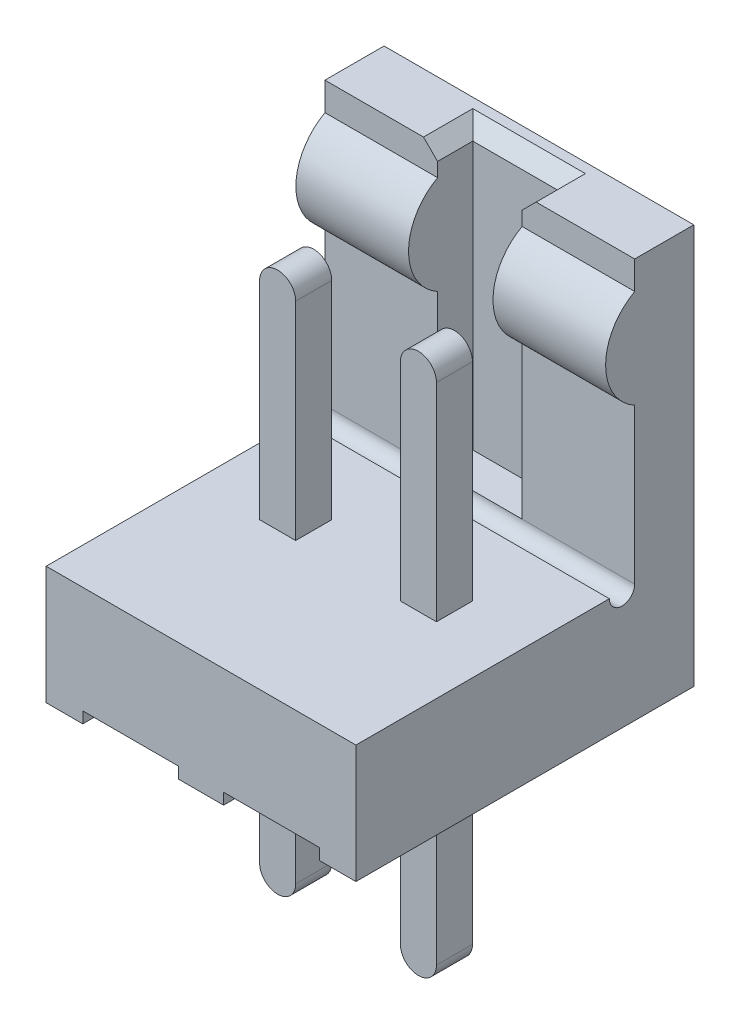
ISO-10303-21;
HEADER;
FILE_DESCRIPTION(('STEP AP214'),'2;1');
FILE_NAME('part.step','',(''),(''),'','','');
FILE_SCHEMA(('AUTOMOTIVE_DESIGN { 1 0 10303 214 1 1 1 1 }'));
ENDSEC;
DATA;
#1=APPLICATION_CONTEXT('core data for automotive mechanical design processes');
#2=APPLICATION_PROTOCOL_DEFINITION('international standard','automotive_design',2000,#1);
#3=PRODUCT_CONTEXT('',#1,'mechanical');
#4=PRODUCT('Part','Part','',(#3));
#5=PRODUCT_RELATED_PRODUCT_CATEGORY('part','',(#4));
#6=PRODUCT_DEFINITION_FORMATION('','',#4);
#7=PRODUCT_DEFINITION_CONTEXT('part definition',#1,'design');
#8=PRODUCT_DEFINITION('design','',#6,#7);
#9=PRODUCT_DEFINITION_SHAPE('','',#8);
#10=(LENGTH_UNIT() NAMED_UNIT(*) SI_UNIT(.MILLI.,.METRE.));
#11=(NAMED_UNIT(*) PLANE_ANGLE_UNIT() SI_UNIT($,.RADIAN.));
#12=(NAMED_UNIT(*) SI_UNIT($,.STERADIAN.) SOLID_ANGLE_UNIT());
#13=UNCERTAINTY_MEASURE_WITH_UNIT(LENGTH_MEASURE(1.E-05),#10,'distance_accuracy_value','');
#14=(GEOMETRIC_REPRESENTATION_CONTEXT(3) GLOBAL_UNCERTAINTY_ASSIGNED_CONTEXT((#13)) GLOBAL_UNIT_ASSIGNED_CONTEXT((#10,
#11,#12)) REPRESENTATION_CONTEXT('',''));
#15=CARTESIAN_POINT('',(0.,0.,0.));
#16=DIRECTION('',(0.,0.,1.));
#17=DIRECTION('',(1.,0.,0.));
#18=AXIS2_PLACEMENT_3D('',#15,#16,#17);
#19=CARTESIAN_POINT('',(1.25,-3.18,0.39));
#20=DIRECTION('',(0.,0.,-1.));
#21=DIRECTION('',(1.,0.,0.));
#22=AXIS2_PLACEMENT_3D('',#19,#20,#21);
#23=CYLINDRICAL_SURFACE('',#22,0.32);
#24=DIRECTION('',(0.,0.,-1.));
#25=VECTOR('',#24,1.);
#26=CARTESIAN_POINT('',(0.93,-3.18,0.39));
#27=LINE('',#26,#25);
#28=CARTESIAN_POINT('',(0.93,-3.18,0.39));
#29=VERTEX_POINT('',#28);
#30=CARTESIAN_POINT('',(0.93,-3.18,-0.25));
#31=VERTEX_POINT('',#30);
#32=EDGE_CURVE('E119',#29,#31,#27,.T.);
#33=ORIENTED_EDGE('',*,*,#32,.T.);
#34=CARTESIAN_POINT('',(1.25,-3.18,-0.25));
#35=DIRECTION('',(0.,0.,1.));
#36=DIRECTION('',(1.,0.,0.));
#37=AXIS2_PLACEMENT_3D('',#34,#35,#36);
#38=CIRCLE('',#37,0.32);
#39=CARTESIAN_POINT('',(1.57,-3.18,-0.25));
#40=VERTEX_POINT('',#39);
#41=EDGE_CURVE('E12',#31,#40,#38,.T.);
#42=ORIENTED_EDGE('',*,*,#41,.T.);
#43=DIRECTION('',(0.,0.,-1.));
#44=VECTOR('',#43,1.);
#45=CARTESIAN_POINT('',(1.57,-3.18,0.39));
#46=LINE('',#45,#44);
#47=CARTESIAN_POINT('',(1.57,-3.18,0.39));
#48=VERTEX_POINT('',#47);
#49=EDGE_CURVE('E121',#40,#48,#46,.F.);
#50=ORIENTED_EDGE('',*,*,#49,.T.);
#51=CARTESIAN_POINT('',(1.25,-3.18,0.39));
#52=DIRECTION('',(0.,0.,-1.));
#53=DIRECTION('',(-1.,0.,0.));
#54=AXIS2_PLACEMENT_3D('',#51,#52,#53);
#55=CIRCLE('',#54,0.32);
#56=EDGE_CURVE('E61',#48,#29,#55,.T.);
#57=ORIENTED_EDGE('',*,*,#56,.T.);
#58=EDGE_LOOP('',(#33,#42,#50,#57));
#59=FACE_BOUND('',#58,.T.);
#60=ADVANCED_FACE('F54',(#59),#23,.T.);
#61=CARTESIAN_POINT('',(1.25,5.78,-0.25));
#62=DIRECTION('',(0.,0.,-1.));
#63=DIRECTION('',(1.,0.,0.));
#64=AXIS2_PLACEMENT_3D('',#61,#62,#63);
#65=CYLINDRICAL_SURFACE('',#64,0.32);
#66=DIRECTION('',(0.,0.,1.));
#67=VECTOR('',#66,1.);
#68=CARTESIAN_POINT('',(0.93,5.78,-0.25));
#69=LINE('',#68,#67);
#70=CARTESIAN_POINT('',(0.93,5.78,-0.25));
#71=VERTEX_POINT('',#70);
#72=CARTESIAN_POINT('',(0.93,5.78,0.39));
#73=VERTEX_POINT('',#72);
#74=EDGE_CURVE('E106',#71,#73,#69,.T.);
#75=ORIENTED_EDGE('',*,*,#74,.T.);
#76=CARTESIAN_POINT('',(1.25,5.78,0.39));
#77=DIRECTION('',(0.,0.,-1.));
#78=DIRECTION('',(-1.,0.,0.));
#79=AXIS2_PLACEMENT_3D('',#76,#77,#78);
#80=CIRCLE('',#79,0.32);
#81=CARTESIAN_POINT('',(1.57,5.78,0.39));
#82=VERTEX_POINT('',#81);
#83=EDGE_CURVE('E108',#73,#82,#80,.T.);
#84=ORIENTED_EDGE('',*,*,#83,.T.);
#85=DIRECTION('',(0.,0.,1.));
#86=VECTOR('',#85,1.);
#87=CARTESIAN_POINT('',(1.57,5.78,-0.25));
#88=LINE('',#87,#86);
#89=CARTESIAN_POINT('',(1.57,5.78,-0.25));
#90=VERTEX_POINT('',#89);
#91=EDGE_CURVE('E107',#82,#90,#88,.F.);
#92=ORIENTED_EDGE('',*,*,#91,.T.);
#93=CARTESIAN_POINT('',(1.25,5.78,-0.25));
#94=DIRECTION('',(0.,0.,1.));
#95=DIRECTION('',(1.,0.,0.));
#96=AXIS2_PLACEMENT_3D('',#93,#94,#95);
#97=CIRCLE('',#96,0.32);
#98=EDGE_CURVE('E95',#90,#71,#97,.T.);
#99=ORIENTED_EDGE('',*,*,#98,.T.);
#100=EDGE_LOOP('',(#75,#84,#92,#99));
#101=FACE_BOUND('',#100,.T.);
#102=ADVANCED_FACE('F104',(#101),#65,.T.);
#103=CARTESIAN_POINT('',(0.93,-3.5,0.39));
#104=DIRECTION('',(-1.,0.,0.));
#105=DIRECTION('',(0.,0.,-1.));
#106=AXIS2_PLACEMENT_3D('',#103,#104,#105);
#107=PLANE('',#106);
#108=DIRECTION('',(0.,1.,0.));
#109=VECTOR('',#108,1.);
#110=CARTESIAN_POINT('',(0.93,-3.5,0.39));
#111=LINE('',#110,#109);
#112=EDGE_CURVE('E111',#29,#73,#111,.T.);
#113=ORIENTED_EDGE('',*,*,#112,.T.);
#114=ORIENTED_EDGE('',*,*,#74,.F.);
#115=DIRECTION('',(0.,1.,0.));
#116=VECTOR('',#115,1.);
#117=CARTESIAN_POINT('',(0.93,-3.5,-0.25));
#118=LINE('',#117,#116);
#119=EDGE_CURVE('E92',#31,#71,#118,.T.);
#120=ORIENTED_EDGE('',*,*,#119,.F.);
#121=ORIENTED_EDGE('',*,*,#32,.F.);
#122=EDGE_LOOP('',(#113,#114,#120,#121));
#123=FACE_BOUND('',#122,.T.);
#124=ADVANCED_FACE('F110',(#123),#107,.T.);
#125=CARTESIAN_POINT('',(1.57,-3.5,0.39));
#126=DIRECTION('',(0.,0.,1.));
#127=DIRECTION('',(-1.,0.,0.));
#128=AXIS2_PLACEMENT_3D('',#125,#126,#127);
#129=PLANE('',#128);
#130=DIRECTION('',(0.,1.,0.));
#131=VECTOR('',#130,1.);
#132=CARTESIAN_POINT('',(1.57,-3.5,0.39));
#133=LINE('',#132,#131);
#134=EDGE_CURVE('E75',#48,#82,#133,.T.);
#135=ORIENTED_EDGE('',*,*,#134,.T.);
#136=ORIENTED_EDGE('',*,*,#83,.F.);
#137=ORIENTED_EDGE('',*,*,#112,.F.);
#138=ORIENTED_EDGE('',*,*,#56,.F.);
#139=EDGE_LOOP('',(#135,#136,#137,#138));
#140=FACE_BOUND('',#139,.T.);
#141=ADVANCED_FACE('F126',(#140),#129,.T.);
#142=CARTESIAN_POINT('',(1.57,-3.5,0.39));
#143=DIRECTION('',(1.,0.,0.));
#144=DIRECTION('',(0.,0.,1.));
#145=AXIS2_PLACEMENT_3D('',#142,#143,#144);
#146=PLANE('',#145);
#147=DIRECTION('',(0.,1.,0.));
#148=VECTOR('',#147,1.);
#149=CARTESIAN_POINT('',(1.57,-3.5,-0.25));
#150=LINE('',#149,#148);
#151=EDGE_CURVE('E68',#40,#90,#150,.T.);
#152=ORIENTED_EDGE('',*,*,#151,.T.);
#153=ORIENTED_EDGE('',*,*,#91,.F.);
#154=ORIENTED_EDGE('',*,*,#134,.F.);
#155=ORIENTED_EDGE('',*,*,#49,.F.);
#156=EDGE_LOOP('',(#152,#153,#154,#155));
#157=FACE_BOUND('',#156,.T.);
#158=ADVANCED_FACE('F128',(#157),#146,.T.);
#159=CARTESIAN_POINT('',(1.57,-3.5,-0.25));
#160=DIRECTION('',(0.,0.,-1.));
#161=DIRECTION('',(1.,0.,0.));
#162=AXIS2_PLACEMENT_3D('',#159,#160,#161);
#163=PLANE('',#162);
#164=ORIENTED_EDGE('',*,*,#119,.T.);
#165=ORIENTED_EDGE('',*,*,#98,.F.);
#166=ORIENTED_EDGE('',*,*,#151,.F.);
#167=ORIENTED_EDGE('',*,*,#41,.F.);
#168=EDGE_LOOP('',(#164,#165,#166,#167));
#169=FACE_BOUND('',#168,.T.);
#170=ADVANCED_FACE('F94',(#169),#163,.T.);
#171=CLOSED_SHELL('',(#60,#102,#124,#141,#158,#170));
#172=MANIFOLD_SOLID_BREP('B2',#171);
#173=CARTESIAN_POINT('',(-1.25,-3.18,0.39));
#174=DIRECTION('',(0.,0.,-1.));
#175=DIRECTION('',(-1.,0.,0.));
#176=AXIS2_PLACEMENT_3D('',#173,#174,#175);
#177=CYLINDRICAL_SURFACE('',#176,0.32);
#178=DIRECTION('',(0.,0.,-1.));
#179=VECTOR('',#178,1.);
#180=CARTESIAN_POINT('',(-0.93,-3.18,0.39));
#181=LINE('',#180,#179);
#182=CARTESIAN_POINT('',(-0.93,-3.18,0.39));
#183=VERTEX_POINT('',#182);
#184=CARTESIAN_POINT('',(-0.93,-3.18,-0.25));
#185=VERTEX_POINT('',#184);
#186=EDGE_CURVE('E231',#183,#185,#181,.T.);
#187=ORIENTED_EDGE('',*,*,#186,.F.);
#188=CARTESIAN_POINT('',(-1.25,-3.18,0.39));
#189=DIRECTION('',(0.,0.,1.));
#190=DIRECTION('',(1.,0.,0.));
#191=AXIS2_PLACEMENT_3D('',#188,#189,#190);
#192=CIRCLE('',#191,0.32);
#193=CARTESIAN_POINT('',(-1.57,-3.18,0.39));
#194=VERTEX_POINT('',#193);
#195=EDGE_CURVE('E195',#194,#183,#192,.T.);
#196=ORIENTED_EDGE('',*,*,#195,.F.);
#197=DIRECTION('',(0.,0.,-1.));
#198=VECTOR('',#197,1.);
#199=CARTESIAN_POINT('',(-1.57,-3.18,0.39));
#200=LINE('',#199,#198);
#201=CARTESIAN_POINT('',(-1.57,-3.18,-0.25));
#202=VERTEX_POINT('',#201);
#203=EDGE_CURVE('E256',#202,#194,#200,.F.);
#204=ORIENTED_EDGE('',*,*,#203,.F.);
#205=CARTESIAN_POINT('',(-1.25,-3.18,-0.25));
#206=DIRECTION('',(0.,0.,-1.));
#207=DIRECTION('',(-1.,0.,0.));
#208=AXIS2_PLACEMENT_3D('',#205,#206,#207);
#209=CIRCLE('',#208,0.32);
#210=EDGE_CURVE('E52',#185,#202,#209,.T.);
#211=ORIENTED_EDGE('',*,*,#210,.F.);
#212=EDGE_LOOP('',(#187,#196,#204,#211));
#213=FACE_BOUND('',#212,.T.);
#214=ADVANCED_FACE('F187',(#213),#177,.T.);
#215=CARTESIAN_POINT('',(-1.25,5.78,-0.25));
#216=DIRECTION('',(0.,0.,-1.));
#217=DIRECTION('',(-1.,0.,0.));
#218=AXIS2_PLACEMENT_3D('',#215,#216,#217);
#219=CYLINDRICAL_SURFACE('',#218,0.32);
#220=DIRECTION('',(0.,0.,1.));
#221=VECTOR('',#220,1.);
#222=CARTESIAN_POINT('',(-0.93,5.78,-0.25));
#223=LINE('',#222,#221);
#224=CARTESIAN_POINT('',(-0.93,5.78,-0.25));
#225=VERTEX_POINT('',#224);
#226=CARTESIAN_POINT('',(-0.93,5.78,0.39));
#227=VERTEX_POINT('',#226);
#228=EDGE_CURVE('E230',#225,#227,#223,.T.);
#229=ORIENTED_EDGE('',*,*,#228,.F.);
#230=CARTESIAN_POINT('',(-1.25,5.78,-0.25));
#231=DIRECTION('',(0.,0.,-1.));
#232=DIRECTION('',(-1.,0.,0.));
#233=AXIS2_PLACEMENT_3D('',#230,#231,#232);
#234=CIRCLE('',#233,0.32);
#235=CARTESIAN_POINT('',(-1.57,5.78,-0.25));
#236=VERTEX_POINT('',#235);
#237=EDGE_CURVE('E235',#236,#225,#234,.T.);
#238=ORIENTED_EDGE('',*,*,#237,.F.);
#239=DIRECTION('',(0.,0.,1.));
#240=VECTOR('',#239,1.);
#241=CARTESIAN_POINT('',(-1.57,5.78,-0.25));
#242=LINE('',#241,#240);
#243=CARTESIAN_POINT('',(-1.57,5.78,0.39));
#244=VERTEX_POINT('',#243);
#245=EDGE_CURVE('E242',#244,#236,#242,.F.);
#246=ORIENTED_EDGE('',*,*,#245,.F.);
#247=CARTESIAN_POINT('',(-1.25,5.78,0.39));
#248=DIRECTION('',(0.,0.,1.));
#249=DIRECTION('',(1.,0.,0.));
#250=AXIS2_PLACEMENT_3D('',#247,#248,#249);
#251=CIRCLE('',#250,0.32);
#252=EDGE_CURVE('E241',#227,#244,#251,.T.);
#253=ORIENTED_EDGE('',*,*,#252,.F.);
#254=EDGE_LOOP('',(#229,#238,#246,#253));
#255=FACE_BOUND('',#254,.T.);
#256=ADVANCED_FACE('F245',(#255),#219,.T.);
#257=CARTESIAN_POINT('',(-0.93,-3.5,0.39));
#258=DIRECTION('',(1.,0.,0.));
#259=DIRECTION('',(0.,0.,-1.));
#260=AXIS2_PLACEMENT_3D('',#257,#258,#259);
#261=PLANE('',#260);
#262=DIRECTION('',(0.,1.,0.));
#263=VECTOR('',#262,1.);
#264=CARTESIAN_POINT('',(-0.93,-3.5,0.39));
#265=LINE('',#264,#263);
#266=EDGE_CURVE('E247',#183,#227,#265,.T.);
#267=ORIENTED_EDGE('',*,*,#266,.F.);
#268=ORIENTED_EDGE('',*,*,#186,.T.);
#269=DIRECTION('',(0.,1.,0.));
#270=VECTOR('',#269,1.);
#271=CARTESIAN_POINT('',(-0.93,-3.5,-0.25));
#272=LINE('',#271,#270);
#273=EDGE_CURVE('E225',#185,#225,#272,.T.);
#274=ORIENTED_EDGE('',*,*,#273,.T.);
#275=ORIENTED_EDGE('',*,*,#228,.T.);
#276=EDGE_LOOP('',(#267,#268,#274,#275));
#277=FACE_BOUND('',#276,.T.);
#278=ADVANCED_FACE('F228',(#277),#261,.T.);
#279=CARTESIAN_POINT('',(-1.57,-3.5,0.39));
#280=DIRECTION('',(0.,0.,1.));
#281=DIRECTION('',(1.,0.,0.));
#282=AXIS2_PLACEMENT_3D('',#279,#280,#281);
#283=PLANE('',#282);
#284=DIRECTION('',(0.,1.,0.));
#285=VECTOR('',#284,1.);
#286=CARTESIAN_POINT('',(-1.57,-3.5,0.39));
#287=LINE('',#286,#285);
#288=EDGE_CURVE('E250',#194,#244,#287,.T.);
#289=ORIENTED_EDGE('',*,*,#288,.F.);
#290=ORIENTED_EDGE('',*,*,#195,.T.);
#291=ORIENTED_EDGE('',*,*,#266,.T.);
#292=ORIENTED_EDGE('',*,*,#252,.T.);
#293=EDGE_LOOP('',(#289,#290,#291,#292));
#294=FACE_BOUND('',#293,.T.);
#295=ADVANCED_FACE('F259',(#294),#283,.T.);
#296=CARTESIAN_POINT('',(-1.57,-3.5,0.39));
#297=DIRECTION('',(-1.,0.,0.));
#298=DIRECTION('',(0.,0.,1.));
#299=AXIS2_PLACEMENT_3D('',#296,#297,#298);
#300=PLANE('',#299);
#301=DIRECTION('',(0.,1.,0.));
#302=VECTOR('',#301,1.);
#303=CARTESIAN_POINT('',(-1.57,-3.5,-0.25));
#304=LINE('',#303,#302);
#305=EDGE_CURVE('E232',#202,#236,#304,.T.);
#306=ORIENTED_EDGE('',*,*,#305,.F.);
#307=ORIENTED_EDGE('',*,*,#203,.T.);
#308=ORIENTED_EDGE('',*,*,#288,.T.);
#309=ORIENTED_EDGE('',*,*,#245,.T.);
#310=EDGE_LOOP('',(#306,#307,#308,#309));
#311=FACE_BOUND('',#310,.T.);
#312=ADVANCED_FACE('F261',(#311),#300,.T.);
#313=CARTESIAN_POINT('',(-1.57,-3.5,-0.25));
#314=DIRECTION('',(0.,0.,-1.));
#315=DIRECTION('',(-1.,0.,0.));
#316=AXIS2_PLACEMENT_3D('',#313,#314,#315);
#317=PLANE('',#316);
#318=ORIENTED_EDGE('',*,*,#273,.F.);
#319=ORIENTED_EDGE('',*,*,#210,.T.);
#320=ORIENTED_EDGE('',*,*,#305,.T.);
#321=ORIENTED_EDGE('',*,*,#237,.T.);
#322=EDGE_LOOP('',(#318,#319,#320,#321));
#323=FACE_BOUND('',#322,.T.);
#324=ADVANCED_FACE('F236',(#323),#317,.T.);
#325=CLOSED_SHELL('',(#214,#256,#278,#295,#312,#324));
#326=MANIFOLD_SOLID_BREP('B6',#325);
#327=CARTESIAN_POINT('',(-2.75,0.,3.));
#328=DIRECTION('',(0.,-1.,0.));
#329=DIRECTION('',(0.,0.,-1.));
#330=AXIS2_PLACEMENT_3D('',#327,#328,#329);
#331=PLANE('',#330);
#332=DIRECTION('',(0.,0.,1.));
#333=VECTOR('',#332,1.);
#334=CARTESIAN_POINT('',(-2.1,0.,-3.));
#335=LINE('',#334,#333);
#336=CARTESIAN_POINT('',(-2.1,0.,-3.));
#337=VERTEX_POINT('',#336);
#338=CARTESIAN_POINT('',(-2.1,0.,3.));
#339=VERTEX_POINT('',#338);
#340=EDGE_CURVE('E486',#337,#339,#335,.T.);
#341=ORIENTED_EDGE('',*,*,#340,.T.);
#342=DIRECTION('',(1.,0.,0.));
#343=VECTOR('',#342,1.);
#344=CARTESIAN_POINT('',(-2.75,0.,3.));
#345=LINE('',#344,#343);
#346=CARTESIAN_POINT('',(-2.75,0.,3.));
#347=VERTEX_POINT('',#346);
#348=EDGE_CURVE('E524',#347,#339,#345,.T.);
#349=ORIENTED_EDGE('',*,*,#348,.F.);
#350=DIRECTION('',(0.,0.,-1.));
#351=VECTOR('',#350,1.);
#352=CARTESIAN_POINT('',(-2.75,0.,3.));
#353=LINE('',#352,#351);
#354=CARTESIAN_POINT('',(-2.75,0.,-3.));
#355=VERTEX_POINT('',#354);
#356=EDGE_CURVE('E511',#347,#355,#353,.T.);
#357=ORIENTED_EDGE('',*,*,#356,.T.);
#358=DIRECTION('',(1.,0.,0.));
#359=VECTOR('',#358,1.);
#360=CARTESIAN_POINT('',(-2.75,0.,-3.));
#361=LINE('',#360,#359);
#362=EDGE_CURVE('E503',#355,#337,#361,.T.);
#363=ORIENTED_EDGE('',*,*,#362,.T.);
#364=EDGE_LOOP('',(#341,#349,#357,#363));
#365=FACE_BOUND('',#364,.T.);
#366=ADVANCED_FACE('F317',(#365),#331,.T.);
#367=DIRECTION('',(0.,0.,1.));
#368=VECTOR('',#367,1.);
#369=CARTESIAN_POINT('',(-0.4,0.,-3.));
#370=LINE('',#369,#368);
#371=CARTESIAN_POINT('',(-0.4,0.,-3.));
#372=VERTEX_POINT('',#371);
#373=CARTESIAN_POINT('',(-0.4,0.,3.));
#374=VERTEX_POINT('',#373);
#375=EDGE_CURVE('E497',#372,#374,#370,.T.);
#376=ORIENTED_EDGE('',*,*,#375,.F.);
#377=CARTESIAN_POINT('',(0.4,0.,-3.));
#378=VERTEX_POINT('',#377);
#379=EDGE_CURVE('E514',#372,#378,#361,.T.);
#380=ORIENTED_EDGE('',*,*,#379,.T.);
#381=DIRECTION('',(0.,0.,1.));
#382=VECTOR('',#381,1.);
#383=CARTESIAN_POINT('',(0.4,0.,-3.));
#384=LINE('',#383,#382);
#385=CARTESIAN_POINT('',(0.4,0.,3.));
#386=VERTEX_POINT('',#385);
#387=EDGE_CURVE('E710',#378,#386,#384,.T.);
#388=ORIENTED_EDGE('',*,*,#387,.T.);
#389=EDGE_CURVE('E530',#374,#386,#345,.T.);
#390=ORIENTED_EDGE('',*,*,#389,.F.);
#391=EDGE_LOOP('',(#376,#380,#388,#390));
#392=FACE_BOUND('',#391,.T.);
#393=ADVANCED_FACE('F781',(#392),#331,.T.);
#394=CARTESIAN_POINT('',(-2.75,2.1,-1.95));
#395=DIRECTION('',(0.,0.,1.));
#396=DIRECTION('',(0.,-1.,0.));
#397=AXIS2_PLACEMENT_3D('',#394,#395,#396);
#398=PLANE('',#397);
#399=DIRECTION('',(1.,0.,0.));
#400=VECTOR('',#399,1.);
#401=CARTESIAN_POINT('',(-2.75,4.85,-1.95));
#402=LINE('',#401,#400);
#403=CARTESIAN_POINT('',(0.75,4.85,-1.95));
#404=VERTEX_POINT('',#403);
#405=CARTESIAN_POINT('',(2.75,4.85,-1.95));
#406=VERTEX_POINT('',#405);
#407=EDGE_CURVE('E571',#404,#406,#402,.T.);
#408=ORIENTED_EDGE('',*,*,#407,.F.);
#409=DIRECTION('',(0.,-1.,0.));
#410=VECTOR('',#409,1.);
#411=CARTESIAN_POINT('',(0.75,2.1,-1.95));
#412=LINE('',#411,#410);
#413=CARTESIAN_POINT('',(0.75,2.1,-1.95));
#414=VERTEX_POINT('',#413);
#415=EDGE_CURVE('E688',#404,#414,#412,.T.);
#416=ORIENTED_EDGE('',*,*,#415,.T.);
#417=DIRECTION('',(1.,0.,0.));
#418=VECTOR('',#417,1.);
#419=CARTESIAN_POINT('',(-2.75,2.1,-1.95));
#420=LINE('',#419,#418);
#421=CARTESIAN_POINT('',(2.75,2.1,-1.95));
#422=VERTEX_POINT('',#421);
#423=EDGE_CURVE('E566',#414,#422,#420,.T.);
#424=ORIENTED_EDGE('',*,*,#423,.T.);
#425=DIRECTION('',(0.,-1.,0.));
#426=VECTOR('',#425,1.);
#427=CARTESIAN_POINT('',(2.75,2.1,-1.95));
#428=LINE('',#427,#426);
#429=EDGE_CURVE('E613',#406,#422,#428,.T.);
#430=ORIENTED_EDGE('',*,*,#429,.F.);
#431=EDGE_LOOP('',(#408,#416,#424,#430));
#432=FACE_BOUND('',#431,.T.);
#433=ADVANCED_FACE('F687',(#432),#398,.T.);
#434=CARTESIAN_POINT('',(-2.75,2.1,-1.95));
#435=VERTEX_POINT('',#434);
#436=CARTESIAN_POINT('',(-0.75,2.1,-1.95));
#437=VERTEX_POINT('',#436);
#438=EDGE_CURVE('E561',#435,#437,#420,.T.);
#439=ORIENTED_EDGE('',*,*,#438,.T.);
#440=DIRECTION('',(0.,1.,0.));
#441=VECTOR('',#440,1.);
#442=CARTESIAN_POINT('',(-0.75,2.1,-1.95));
#443=LINE('',#442,#441);
#444=CARTESIAN_POINT('',(-0.75,4.85,-1.95));
#445=VERTEX_POINT('',#444);
#446=EDGE_CURVE('E762',#437,#445,#443,.T.);
#447=ORIENTED_EDGE('',*,*,#446,.T.);
#448=CARTESIAN_POINT('',(-2.75,4.85,-1.95));
#449=VERTEX_POINT('',#448);
#450=EDGE_CURVE('E567',#449,#445,#402,.T.);
#451=ORIENTED_EDGE('',*,*,#450,.F.);
#452=DIRECTION('',(0.,-1.,0.));
#453=VECTOR('',#452,1.);
#454=CARTESIAN_POINT('',(-2.75,2.1,-1.95));
#455=LINE('',#454,#453);
#456=EDGE_CURVE('E550',#449,#435,#455,.T.);
#457=ORIENTED_EDGE('',*,*,#456,.T.);
#458=EDGE_LOOP('',(#439,#447,#451,#457));
#459=FACE_BOUND('',#458,.T.);
#460=ADVANCED_FACE('F650',(#459),#398,.T.);
#461=CARTESIAN_POINT('',(-2.75,5.725,-2.43412291827593));
#462=DIRECTION('',(1.,0.,0.));
#463=DIRECTION('',(0.,0.,-1.));
#464=AXIS2_PLACEMENT_3D('',#461,#462,#463);
#465=CYLINDRICAL_SURFACE('',#464,1.);
#466=DIRECTION('',(1.,0.,0.));
#467=VECTOR('',#466,1.);
#468=CARTESIAN_POINT('',(-2.75,6.6,-1.95));
#469=LINE('',#468,#467);
#470=CARTESIAN_POINT('',(0.75,6.6,-1.95));
#471=VERTEX_POINT('',#470);
#472=CARTESIAN_POINT('',(2.75,6.6,-1.95));
#473=VERTEX_POINT('',#472);
#474=EDGE_CURVE('E576',#471,#473,#469,.T.);
#475=ORIENTED_EDGE('',*,*,#474,.F.);
#476=CARTESIAN_POINT('',(0.75,5.725,-2.43412291827593));
#477=DIRECTION('',(-1.,0.,0.));
#478=DIRECTION('',(0.,0.,1.));
#479=AXIS2_PLACEMENT_3D('',#476,#477,#478);
#480=CIRCLE('',#479,1.);
#481=EDGE_CURVE('E693',#471,#404,#480,.F.);
#482=ORIENTED_EDGE('',*,*,#481,.T.);
#483=ORIENTED_EDGE('',*,*,#407,.T.);
#484=CARTESIAN_POINT('',(2.75,5.725,-2.43412291827593));
#485=DIRECTION('',(1.,0.,0.));
#486=DIRECTION('',(0.,0.,1.));
#487=AXIS2_PLACEMENT_3D('',#484,#485,#486);
#488=CIRCLE('',#487,1.);
#489=EDGE_CURVE('E610',#473,#406,#488,.T.);
#490=ORIENTED_EDGE('',*,*,#489,.F.);
#491=EDGE_LOOP('',(#475,#482,#483,#490));
#492=FACE_BOUND('',#491,.T.);
#493=ADVANCED_FACE('F770',(#492),#465,.T.);
#494=ORIENTED_EDGE('',*,*,#450,.T.);
#495=CARTESIAN_POINT('',(-0.75,5.725,-2.43412291827593));
#496=DIRECTION('',(1.,0.,0.));
#497=DIRECTION('',(0.,0.,-1.));
#498=AXIS2_PLACEMENT_3D('',#495,#496,#497);
#499=CIRCLE('',#498,1.);
#500=CARTESIAN_POINT('',(-0.75,6.6,-1.95));
#501=VERTEX_POINT('',#500);
#502=EDGE_CURVE('E661',#445,#501,#499,.F.);
#503=ORIENTED_EDGE('',*,*,#502,.T.);
#504=CARTESIAN_POINT('',(-2.75,6.6,-1.95));
#505=VERTEX_POINT('',#504);
#506=EDGE_CURVE('E572',#505,#501,#469,.T.);
#507=ORIENTED_EDGE('',*,*,#506,.F.);
#508=CARTESIAN_POINT('',(-2.75,5.725,-2.43412291827593));
#509=DIRECTION('',(1.,0.,0.));
#510=DIRECTION('',(0.,0.,1.));
#511=AXIS2_PLACEMENT_3D('',#508,#509,#510);
#512=CIRCLE('',#511,1.);
#513=EDGE_CURVE('E643',#505,#449,#512,.T.);
#514=ORIENTED_EDGE('',*,*,#513,.T.);
#515=EDGE_LOOP('',(#494,#503,#507,#514));
#516=FACE_BOUND('',#515,.T.);
#517=ADVANCED_FACE('F659',(#516),#465,.T.);
#518=CARTESIAN_POINT('',(-2.75,7.1,-1.95));
#519=DIRECTION('',(0.,0.,1.));
#520=DIRECTION('',(1.,0.,0.));
#521=AXIS2_PLACEMENT_3D('',#518,#519,#520);
#522=PLANE('',#521);
#523=DIRECTION('',(1.,0.,0.));
#524=VECTOR('',#523,1.);
#525=CARTESIAN_POINT('',(-2.75,7.1,-1.95));
#526=LINE('',#525,#524);
#527=CARTESIAN_POINT('',(1.,7.1,-1.95));
#528=VERTEX_POINT('',#527);
#529=CARTESIAN_POINT('',(2.75,7.1,-1.95));
#530=VERTEX_POINT('',#529);
#531=EDGE_CURVE('E519',#528,#530,#526,.T.);
#532=ORIENTED_EDGE('',*,*,#531,.F.);
#533=DIRECTION('',(0.70710678118655,0.707106781186545,0.));
#534=VECTOR('',#533,1.);
#535=CARTESIAN_POINT('',(-0.875000000000014,5.225,-1.95));
#536=LINE('',#535,#534);
#537=CARTESIAN_POINT('',(0.75,6.85,-1.95));
#538=VERTEX_POINT('',#537);
#539=EDGE_CURVE('E766',#528,#538,#536,.F.);
#540=ORIENTED_EDGE('',*,*,#539,.T.);
#541=DIRECTION('',(0.,-1.,0.));
#542=VECTOR('',#541,1.);
#543=CARTESIAN_POINT('',(0.75,7.1,-1.95));
#544=LINE('',#543,#542);
#545=EDGE_CURVE('E699',#538,#471,#544,.T.);
#546=ORIENTED_EDGE('',*,*,#545,.T.);
#547=ORIENTED_EDGE('',*,*,#474,.T.);
#548=DIRECTION('',(0.,-1.,0.));
#549=VECTOR('',#548,1.);
#550=CARTESIAN_POINT('',(2.75,7.1,-1.95));
#551=LINE('',#550,#549);
#552=EDGE_CURVE('E601',#530,#473,#551,.T.);
#553=ORIENTED_EDGE('',*,*,#552,.F.);
#554=EDGE_LOOP('',(#532,#540,#546,#547,#553));
#555=FACE_BOUND('',#554,.T.);
#556=ADVANCED_FACE('F607',(#555),#522,.T.);
#557=DIRECTION('',(0.,1.,0.));
#558=VECTOR('',#557,1.);
#559=CARTESIAN_POINT('',(-0.75,7.1,-1.95));
#560=LINE('',#559,#558);
#561=CARTESIAN_POINT('',(-0.75,6.85,-1.95));
#562=VERTEX_POINT('',#561);
#563=EDGE_CURVE('E665',#501,#562,#560,.T.);
#564=ORIENTED_EDGE('',*,*,#563,.T.);
#565=DIRECTION('',(0.70710678118655,-0.707106781186545,0.));
#566=VECTOR('',#565,1.);
#567=CARTESIAN_POINT('',(-1.87500000000001,7.975,-1.95));
#568=LINE('',#567,#566);
#569=CARTESIAN_POINT('',(-0.999999999999999,7.1,-1.95));
#570=VERTEX_POINT('',#569);
#571=EDGE_CURVE('E185',#562,#570,#568,.F.);
#572=ORIENTED_EDGE('',*,*,#571,.T.);
#573=CARTESIAN_POINT('',(-2.75,7.1,-1.95));
#574=VERTEX_POINT('',#573);
#575=EDGE_CURVE('E577',#574,#570,#526,.T.);
#576=ORIENTED_EDGE('',*,*,#575,.F.);
#577=DIRECTION('',(0.,-1.,0.));
#578=VECTOR('',#577,1.);
#579=CARTESIAN_POINT('',(-2.75,7.1,-1.95));
#580=LINE('',#579,#578);
#581=EDGE_CURVE('E639',#574,#505,#580,.T.);
#582=ORIENTED_EDGE('',*,*,#581,.T.);
#583=ORIENTED_EDGE('',*,*,#506,.T.);
#584=EDGE_LOOP('',(#564,#572,#576,#582,#583));
#585=FACE_BOUND('',#584,.T.);
#586=ADVANCED_FACE('F664',(#585),#522,.T.);
#587=CARTESIAN_POINT('',(-2.75,7.1,-3.));
#588=DIRECTION('',(0.,1.,0.));
#589=DIRECTION('',(0.,0.,1.));
#590=AXIS2_PLACEMENT_3D('',#587,#588,#589);
#591=PLANE('',#590);
#592=DIRECTION('',(1.,0.,0.));
#593=VECTOR('',#592,1.);
#594=CARTESIAN_POINT('',(-2.75,7.1,-2.825));
#595=LINE('',#594,#593);
#596=CARTESIAN_POINT('',(-0.999999999999999,7.1,-2.825));
#597=VERTEX_POINT('',#596);
#598=CARTESIAN_POINT('',(1.,7.1,-2.825));
#599=VERTEX_POINT('',#598);
#600=EDGE_CURVE('E1050',#597,#599,#595,.T.);
#601=ORIENTED_EDGE('',*,*,#600,.T.);
#602=DIRECTION('',(0.,0.,1.));
#603=VECTOR('',#602,1.);
#604=CARTESIAN_POINT('',(1.,7.1,-3.));
#605=LINE('',#604,#603);
#606=EDGE_CURVE('E592',#599,#528,#605,.T.);
#607=ORIENTED_EDGE('',*,*,#606,.T.);
#608=ORIENTED_EDGE('',*,*,#531,.T.);
#609=DIRECTION('',(0.,0.,1.));
#610=VECTOR('',#609,1.);
#611=CARTESIAN_POINT('',(2.75,7.1,-3.));
#612=LINE('',#611,#610);
#613=CARTESIAN_POINT('',(2.75,7.1,-3.));
#614=VERTEX_POINT('',#613);
#615=EDGE_CURVE('E590',#614,#530,#612,.T.);
#616=ORIENTED_EDGE('',*,*,#615,.F.);
#617=DIRECTION('',(1.,0.,0.));
#618=VECTOR('',#617,1.);
#619=CARTESIAN_POINT('',(-2.75,7.1,-3.));
#620=LINE('',#619,#618);
#621=CARTESIAN_POINT('',(-2.75,7.1,-3.));
#622=VERTEX_POINT('',#621);
#623=EDGE_CURVE('E513',#622,#614,#620,.T.);
#624=ORIENTED_EDGE('',*,*,#623,.F.);
#625=DIRECTION('',(0.,0.,1.));
#626=VECTOR('',#625,1.);
#627=CARTESIAN_POINT('',(-2.75,7.1,-3.));
#628=LINE('',#627,#626);
#629=EDGE_CURVE('E636',#622,#574,#628,.T.);
#630=ORIENTED_EDGE('',*,*,#629,.T.);
#631=ORIENTED_EDGE('',*,*,#575,.T.);
#632=DIRECTION('',(0.,0.,-1.));
#633=VECTOR('',#632,1.);
#634=CARTESIAN_POINT('',(-0.999999999999999,7.1,-3.));
#635=LINE('',#634,#633);
#636=EDGE_CURVE('E557',#570,#597,#635,.T.);
#637=ORIENTED_EDGE('',*,*,#636,.T.);
#638=EDGE_LOOP('',(#601,#607,#608,#616,#624,#630,#631,#637));
#639=FACE_BOUND('',#638,.T.);
#640=ADVANCED_FACE('F589',(#639),#591,.T.);
#641=CARTESIAN_POINT('',(-2.75,0.,3.));
#642=DIRECTION('',(0.,0.,1.));
#643=DIRECTION('',(1.,0.,0.));
#644=AXIS2_PLACEMENT_3D('',#641,#642,#643);
#645=PLANE('',#644);
#646=DIRECTION('',(0.,-1.,0.));
#647=VECTOR('',#646,1.);
#648=CARTESIAN_POINT('',(-2.1,0.,3.));
#649=LINE('',#648,#647);
#650=CARTESIAN_POINT('',(-2.1,0.2,3.));
#651=VERTEX_POINT('',#650);
#652=EDGE_CURVE('E492',#651,#339,#649,.T.);
#653=ORIENTED_EDGE('',*,*,#652,.F.);
#654=DIRECTION('',(-1.,0.,0.));
#655=VECTOR('',#654,1.);
#656=CARTESIAN_POINT('',(-2.1,0.2,3.));
#657=LINE('',#656,#655);
#658=CARTESIAN_POINT('',(-0.400000000000001,0.2,3.));
#659=VERTEX_POINT('',#658);
#660=EDGE_CURVE('E507',#659,#651,#657,.T.);
#661=ORIENTED_EDGE('',*,*,#660,.F.);
#662=DIRECTION('',(0.,1.,0.));
#663=VECTOR('',#662,1.);
#664=CARTESIAN_POINT('',(-0.4,0.,3.));
#665=LINE('',#664,#663);
#666=EDGE_CURVE('E1014',#374,#659,#665,.T.);
#667=ORIENTED_EDGE('',*,*,#666,.F.);
#668=ORIENTED_EDGE('',*,*,#389,.T.);
#669=DIRECTION('',(0.,-1.,0.));
#670=VECTOR('',#669,1.);
#671=CARTESIAN_POINT('',(0.4,0.,3.));
#672=LINE('',#671,#670);
#673=CARTESIAN_POINT('',(0.4,0.2,3.));
#674=VERTEX_POINT('',#673);
#675=EDGE_CURVE('E725',#674,#386,#672,.T.);
#676=ORIENTED_EDGE('',*,*,#675,.F.);
#677=DIRECTION('',(-1.,0.,0.));
#678=VECTOR('',#677,1.);
#679=CARTESIAN_POINT('',(0.4,0.2,3.));
#680=LINE('',#679,#678);
#681=CARTESIAN_POINT('',(2.1,0.2,3.));
#682=VERTEX_POINT('',#681);
#683=EDGE_CURVE('E722',#682,#674,#680,.T.);
#684=ORIENTED_EDGE('',*,*,#683,.F.);
#685=DIRECTION('',(0.,1.,0.));
#686=VECTOR('',#685,1.);
#687=CARTESIAN_POINT('',(2.1,0.,3.));
#688=LINE('',#687,#686);
#689=CARTESIAN_POINT('',(2.1,0.,3.));
#690=VERTEX_POINT('',#689);
#691=EDGE_CURVE('E728',#690,#682,#688,.T.);
#692=ORIENTED_EDGE('',*,*,#691,.F.);
#693=CARTESIAN_POINT('',(2.75,0.,3.));
#694=VERTEX_POINT('',#693);
#695=EDGE_CURVE('E531',#690,#694,#345,.T.);
#696=ORIENTED_EDGE('',*,*,#695,.T.);
#697=DIRECTION('',(0.,-1.,0.));
#698=VECTOR('',#697,1.);
#699=CARTESIAN_POINT('',(2.75,0.,3.));
#700=LINE('',#699,#698);
#701=CARTESIAN_POINT('',(2.75,2.1,3.));
#702=VERTEX_POINT('',#701);
#703=EDGE_CURVE('E669',#702,#694,#700,.T.);
#704=ORIENTED_EDGE('',*,*,#703,.F.);
#705=DIRECTION('',(1.,0.,0.));
#706=VECTOR('',#705,1.);
#707=CARTESIAN_POINT('',(-2.75,2.1,3.));
#708=LINE('',#707,#706);
#709=CARTESIAN_POINT('',(-2.75,2.1,3.));
#710=VERTEX_POINT('',#709);
#711=EDGE_CURVE('E554',#710,#702,#708,.T.);
#712=ORIENTED_EDGE('',*,*,#711,.F.);
#713=DIRECTION('',(0.,-1.,0.));
#714=VECTOR('',#713,1.);
#715=CARTESIAN_POINT('',(-2.75,0.,3.));
#716=LINE('',#715,#714);
#717=EDGE_CURVE('E628',#710,#347,#716,.T.);
#718=ORIENTED_EDGE('',*,*,#717,.T.);
#719=ORIENTED_EDGE('',*,*,#348,.T.);
#720=EDGE_LOOP('',(#653,#661,#667,#668,#676,#684,#692,#696,#704,#712,#718,#719));
#721=FACE_BOUND('',#720,.T.);
#722=ADVANCED_FACE('F668',(#721),#645,.T.);
#723=CARTESIAN_POINT('',(-2.75,2.1,3.));
#724=DIRECTION('',(0.,1.,0.));
#725=DIRECTION('',(0.,0.,1.));
#726=AXIS2_PLACEMENT_3D('',#723,#724,#725);
#727=PLANE('',#726);
#728=DIRECTION('',(0.,0.,1.));
#729=VECTOR('',#728,1.);
#730=CARTESIAN_POINT('',(2.75,2.1,3.));
#731=LINE('',#730,#729);
#732=CARTESIAN_POINT('',(2.75,2.1,-1.5));
#733=VERTEX_POINT('',#732);
#734=EDGE_CURVE('E624',#733,#702,#731,.T.);
#735=ORIENTED_EDGE('',*,*,#734,.F.);
#736=DIRECTION('',(1.,0.,0.));
#737=VECTOR('',#736,1.);
#738=CARTESIAN_POINT('',(-2.75,2.1,-1.5));
#739=LINE('',#738,#737);
#740=CARTESIAN_POINT('',(-2.75,2.1,-1.5));
#741=VERTEX_POINT('',#740);
#742=EDGE_CURVE('E558',#741,#733,#739,.T.);
#743=ORIENTED_EDGE('',*,*,#742,.F.);
#744=DIRECTION('',(0.,0.,1.));
#745=VECTOR('',#744,1.);
#746=CARTESIAN_POINT('',(-2.75,2.1,3.));
#747=LINE('',#746,#745);
#748=EDGE_CURVE('E538',#741,#710,#747,.T.);
#749=ORIENTED_EDGE('',*,*,#748,.T.);
#750=ORIENTED_EDGE('',*,*,#711,.T.);
#751=EDGE_LOOP('',(#735,#743,#749,#750));
#752=FACE_BOUND('',#751,.T.);
#753=ADVANCED_FACE('F671',(#752),#727,.T.);
#754=CARTESIAN_POINT('',(-2.75,2.1,-1.725));
#755=DIRECTION('',(1.,0.,0.));
#756=DIRECTION('',(0.,0.,-1.));
#757=AXIS2_PLACEMENT_3D('',#754,#755,#756);
#758=CYLINDRICAL_SURFACE('',#757,0.225);
#759=ORIENTED_EDGE('',*,*,#742,.T.);
#760=CARTESIAN_POINT('',(2.75,2.1,-1.725));
#761=DIRECTION('',(-1.,0.,0.));
#762=DIRECTION('',(0.,0.,1.));
#763=AXIS2_PLACEMENT_3D('',#760,#761,#762);
#764=CIRCLE('',#763,0.225);
#765=EDGE_CURVE('E620',#422,#733,#764,.T.);
#766=ORIENTED_EDGE('',*,*,#765,.F.);
#767=ORIENTED_EDGE('',*,*,#423,.F.);
#768=EDGE_CURVE('E565',#437,#414,#420,.T.);
#769=ORIENTED_EDGE('',*,*,#768,.F.);
#770=ORIENTED_EDGE('',*,*,#438,.F.);
#771=CARTESIAN_POINT('',(-2.75,2.1,-1.725));
#772=DIRECTION('',(-1.,0.,0.));
#773=DIRECTION('',(0.,0.,1.));
#774=AXIS2_PLACEMENT_3D('',#771,#772,#773);
#775=CIRCLE('',#774,0.225);
#776=EDGE_CURVE('E544',#435,#741,#775,.T.);
#777=ORIENTED_EDGE('',*,*,#776,.T.);
#778=EDGE_LOOP('',(#759,#766,#767,#769,#770,#777));
#779=FACE_BOUND('',#778,.T.);
#780=ADVANCED_FACE('F676',(#779),#758,.F.);
#781=CARTESIAN_POINT('',(-2.75,0.,-3.));
#782=DIRECTION('',(0.,0.,-1.));
#783=DIRECTION('',(-1.,0.,0.));
#784=AXIS2_PLACEMENT_3D('',#781,#782,#783);
#785=PLANE('',#784);
#786=DIRECTION('',(0.,-1.,0.));
#787=VECTOR('',#786,1.);
#788=CARTESIAN_POINT('',(-2.1,0.,-3.));
#789=LINE('',#788,#787);
#790=CARTESIAN_POINT('',(-2.1,0.2,-3.));
#791=VERTEX_POINT('',#790);
#792=EDGE_CURVE('E489',#791,#337,#789,.T.);
#793=ORIENTED_EDGE('',*,*,#792,.T.);
#794=ORIENTED_EDGE('',*,*,#362,.F.);
#795=DIRECTION('',(0.,1.,0.));
#796=VECTOR('',#795,1.);
#797=CARTESIAN_POINT('',(-2.75,0.,-3.));
#798=LINE('',#797,#796);
#799=EDGE_CURVE('E633',#355,#622,#798,.T.);
#800=ORIENTED_EDGE('',*,*,#799,.T.);
#801=ORIENTED_EDGE('',*,*,#623,.T.);
#802=DIRECTION('',(0.,1.,0.));
#803=VECTOR('',#802,1.);
#804=CARTESIAN_POINT('',(2.75,0.,-3.));
#805=LINE('',#804,#803);
#806=CARTESIAN_POINT('',(2.75,0.,-3.));
#807=VERTEX_POINT('',#806);
#808=EDGE_CURVE('E604',#807,#614,#805,.T.);
#809=ORIENTED_EDGE('',*,*,#808,.F.);
#810=CARTESIAN_POINT('',(2.1,0.,-3.));
#811=VERTEX_POINT('',#810);
#812=EDGE_CURVE('E516',#811,#807,#361,.T.);
#813=ORIENTED_EDGE('',*,*,#812,.F.);
#814=DIRECTION('',(0.,1.,0.));
#815=VECTOR('',#814,1.);
#816=CARTESIAN_POINT('',(2.1,0.,-3.));
#817=LINE('',#816,#815);
#818=CARTESIAN_POINT('',(2.1,0.2,-3.));
#819=VERTEX_POINT('',#818);
#820=EDGE_CURVE('E335',#811,#819,#817,.T.);
#821=ORIENTED_EDGE('',*,*,#820,.T.);
#822=DIRECTION('',(-1.,0.,0.));
#823=VECTOR('',#822,1.);
#824=CARTESIAN_POINT('',(0.4,0.2,-3.));
#825=LINE('',#824,#823);
#826=CARTESIAN_POINT('',(0.4,0.2,-3.));
#827=VERTEX_POINT('',#826);
#828=EDGE_CURVE('E715',#819,#827,#825,.T.);
#829=ORIENTED_EDGE('',*,*,#828,.T.);
#830=DIRECTION('',(0.,-1.,0.));
#831=VECTOR('',#830,1.);
#832=CARTESIAN_POINT('',(0.4,0.,-3.));
#833=LINE('',#832,#831);
#834=EDGE_CURVE('E717',#827,#378,#833,.T.);
#835=ORIENTED_EDGE('',*,*,#834,.T.);
#836=ORIENTED_EDGE('',*,*,#379,.F.);
#837=DIRECTION('',(0.,1.,0.));
#838=VECTOR('',#837,1.);
#839=CARTESIAN_POINT('',(-0.4,0.,-3.));
#840=LINE('',#839,#838);
#841=CARTESIAN_POINT('',(-0.400000000000001,0.2,-3.));
#842=VERTEX_POINT('',#841);
#843=EDGE_CURVE('E343',#372,#842,#840,.T.);
#844=ORIENTED_EDGE('',*,*,#843,.T.);
#845=DIRECTION('',(-1.,0.,0.));
#846=VECTOR('',#845,1.);
#847=CARTESIAN_POINT('',(-2.1,0.2,-3.));
#848=LINE('',#847,#846);
#849=EDGE_CURVE('E498',#842,#791,#848,.T.);
#850=ORIENTED_EDGE('',*,*,#849,.T.);
#851=EDGE_LOOP('',(#793,#794,#800,#801,#809,#813,#821,#829,#835,#836,#844,#850));
#852=FACE_BOUND('',#851,.T.);
#853=ADVANCED_FACE('F501',(#852),#785,.T.);
#854=DIRECTION('',(0.,0.,1.));
#855=VECTOR('',#854,1.);
#856=CARTESIAN_POINT('',(2.1,0.,-3.));
#857=LINE('',#856,#855);
#858=EDGE_CURVE('E706',#811,#690,#857,.T.);
#859=ORIENTED_EDGE('',*,*,#858,.F.);
#860=ORIENTED_EDGE('',*,*,#812,.T.);
#861=DIRECTION('',(0.,0.,-1.));
#862=VECTOR('',#861,1.);
#863=CARTESIAN_POINT('',(2.75,0.,3.));
#864=LINE('',#863,#862);
#865=EDGE_CURVE('E697',#694,#807,#864,.T.);
#866=ORIENTED_EDGE('',*,*,#865,.F.);
#867=ORIENTED_EDGE('',*,*,#695,.F.);
#868=EDGE_LOOP('',(#859,#860,#866,#867));
#869=FACE_BOUND('',#868,.T.);
#870=ADVANCED_FACE('F705',(#869),#331,.T.);
#871=CARTESIAN_POINT('',(-2.75,2.1,-1.725));
#872=DIRECTION('',(-1.,0.,0.));
#873=DIRECTION('',(0.,0.,1.));
#874=AXIS2_PLACEMENT_3D('',#871,#872,#873);
#875=PLANE('',#874);
#876=ORIENTED_EDGE('',*,*,#717,.F.);
#877=ORIENTED_EDGE('',*,*,#748,.F.);
#878=ORIENTED_EDGE('',*,*,#776,.F.);
#879=ORIENTED_EDGE('',*,*,#456,.F.);
#880=ORIENTED_EDGE('',*,*,#513,.F.);
#881=ORIENTED_EDGE('',*,*,#581,.F.);
#882=ORIENTED_EDGE('',*,*,#629,.F.);
#883=ORIENTED_EDGE('',*,*,#799,.F.);
#884=ORIENTED_EDGE('',*,*,#356,.F.);
#885=EDGE_LOOP('',(#876,#877,#878,#879,#880,#881,#882,#883,#884));
#886=FACE_BOUND('',#885,.T.);
#887=ADVANCED_FACE('F656',(#886),#875,.T.);
#888=CARTESIAN_POINT('',(2.75,2.1,-1.725));
#889=DIRECTION('',(-1.,0.,0.));
#890=DIRECTION('',(0.,0.,1.));
#891=AXIS2_PLACEMENT_3D('',#888,#889,#890);
#892=PLANE('',#891);
#893=ORIENTED_EDGE('',*,*,#703,.T.);
#894=ORIENTED_EDGE('',*,*,#865,.T.);
#895=ORIENTED_EDGE('',*,*,#808,.T.);
#896=ORIENTED_EDGE('',*,*,#615,.T.);
#897=ORIENTED_EDGE('',*,*,#552,.T.);
#898=ORIENTED_EDGE('',*,*,#489,.T.);
#899=ORIENTED_EDGE('',*,*,#429,.T.);
#900=ORIENTED_EDGE('',*,*,#765,.T.);
#901=ORIENTED_EDGE('',*,*,#734,.T.);
#902=EDGE_LOOP('',(#893,#894,#895,#896,#897,#898,#899,#900,#901));
#903=FACE_BOUND('',#902,.T.);
#904=ADVANCED_FACE('F599',(#903),#892,.F.);
#905=CARTESIAN_POINT('',(0.75,7.1,-1.325));
#906=DIRECTION('',(-1.,0.,0.));
#907=DIRECTION('',(0.,0.,1.));
#908=AXIS2_PLACEMENT_3D('',#905,#906,#907);
#909=PLANE('',#908);
#910=ORIENTED_EDGE('',*,*,#545,.F.);
#911=DIRECTION('',(0.,0.,-1.));
#912=VECTOR('',#911,1.);
#913=CARTESIAN_POINT('',(0.75,6.85,-1.325));
#914=LINE('',#913,#912);
#915=CARTESIAN_POINT('',(0.75,6.85,-2.575));
#916=VERTEX_POINT('',#915);
#917=EDGE_CURVE('E1056',#538,#916,#914,.T.);
#918=ORIENTED_EDGE('',*,*,#917,.T.);
#919=DIRECTION('',(0.,-1.,0.));
#920=VECTOR('',#919,1.);
#921=CARTESIAN_POINT('',(0.75,7.1,-2.575));
#922=LINE('',#921,#920);
#923=CARTESIAN_POINT('',(0.75,2.1,-2.575));
#924=VERTEX_POINT('',#923);
#925=EDGE_CURVE('E755',#916,#924,#922,.T.);
#926=ORIENTED_EDGE('',*,*,#925,.T.);
#927=DIRECTION('',(0.,0.,-1.));
#928=VECTOR('',#927,1.);
#929=CARTESIAN_POINT('',(0.75,2.1,-1.325));
#930=LINE('',#929,#928);
#931=EDGE_CURVE('E742',#414,#924,#930,.T.);
#932=ORIENTED_EDGE('',*,*,#931,.F.);
#933=ORIENTED_EDGE('',*,*,#415,.F.);
#934=ORIENTED_EDGE('',*,*,#481,.F.);
#935=EDGE_LOOP('',(#910,#918,#926,#932,#933,#934));
#936=FACE_BOUND('',#935,.T.);
#937=ADVANCED_FACE('F768',(#936),#909,.T.);
#938=CARTESIAN_POINT('',(-0.75,7.1,-2.575));
#939=DIRECTION('',(0.,0.,1.));
#940=DIRECTION('',(1.,0.,0.));
#941=AXIS2_PLACEMENT_3D('',#938,#939,#940);
#942=PLANE('',#941);
#943=ORIENTED_EDGE('',*,*,#925,.F.);
#944=DIRECTION('',(-1.,0.,0.));
#945=VECTOR('',#944,1.);
#946=CARTESIAN_POINT('',(-0.75,6.85,-2.575));
#947=LINE('',#946,#945);
#948=CARTESIAN_POINT('',(-0.75,6.85,-2.575));
#949=VERTEX_POINT('',#948);
#950=EDGE_CURVE('E1049',#916,#949,#947,.T.);
#951=ORIENTED_EDGE('',*,*,#950,.T.);
#952=DIRECTION('',(0.,-1.,0.));
#953=VECTOR('',#952,1.);
#954=CARTESIAN_POINT('',(-0.75,7.1,-2.575));
#955=LINE('',#954,#953);
#956=CARTESIAN_POINT('',(-0.75,2.1,-2.575));
#957=VERTEX_POINT('',#956);
#958=EDGE_CURVE('E752',#949,#957,#955,.T.);
#959=ORIENTED_EDGE('',*,*,#958,.T.);
#960=DIRECTION('',(-1.,0.,0.));
#961=VECTOR('',#960,1.);
#962=CARTESIAN_POINT('',(-0.75,2.1,-2.575));
#963=LINE('',#962,#961);
#964=EDGE_CURVE('E745',#924,#957,#963,.T.);
#965=ORIENTED_EDGE('',*,*,#964,.F.);
#966=EDGE_LOOP('',(#943,#951,#959,#965));
#967=FACE_BOUND('',#966,.T.);
#968=ADVANCED_FACE('F879',(#967),#942,.T.);
#969=CARTESIAN_POINT('',(-0.75,7.1,-1.325));
#970=DIRECTION('',(1.,0.,0.));
#971=DIRECTION('',(0.,0.,-1.));
#972=AXIS2_PLACEMENT_3D('',#969,#970,#971);
#973=PLANE('',#972);
#974=ORIENTED_EDGE('',*,*,#958,.F.);
#975=DIRECTION('',(0.,0.,1.));
#976=VECTOR('',#975,1.);
#977=CARTESIAN_POINT('',(-0.75,6.85,-1.325));
#978=LINE('',#977,#976);
#979=EDGE_CURVE('E327',#949,#562,#978,.T.);
#980=ORIENTED_EDGE('',*,*,#979,.T.);
#981=ORIENTED_EDGE('',*,*,#563,.F.);
#982=ORIENTED_EDGE('',*,*,#502,.F.);
#983=ORIENTED_EDGE('',*,*,#446,.F.);
#984=DIRECTION('',(0.,0.,1.));
#985=VECTOR('',#984,1.);
#986=CARTESIAN_POINT('',(-0.75,2.1,-1.325));
#987=LINE('',#986,#985);
#988=EDGE_CURVE('E749',#957,#437,#987,.T.);
#989=ORIENTED_EDGE('',*,*,#988,.F.);
#990=EDGE_LOOP('',(#974,#980,#981,#982,#983,#989));
#991=FACE_BOUND('',#990,.T.);
#992=ADVANCED_FACE('F839',(#991),#973,.T.);
#993=CARTESIAN_POINT('',(0.,2.1,0.));
#994=DIRECTION('',(0.,-1.,0.));
#995=DIRECTION('',(0.,0.,-1.));
#996=AXIS2_PLACEMENT_3D('',#993,#994,#995);
#997=PLANE('',#996);
#998=ORIENTED_EDGE('',*,*,#768,.T.);
#999=ORIENTED_EDGE('',*,*,#931,.T.);
#1000=ORIENTED_EDGE('',*,*,#964,.T.);
#1001=ORIENTED_EDGE('',*,*,#988,.T.);
#1002=EDGE_LOOP('',(#998,#999,#1000,#1001));
#1003=FACE_BOUND('',#1002,.T.);
#1004=ADVANCED_FACE('F835',(#1003),#997,.F.);
#1005=CARTESIAN_POINT('',(-0.75,6.85,-1.325));
#1006=DIRECTION('',(-0.707106781186545,-0.70710678118655,0.));
#1007=DIRECTION('',(0.,0.,1.));
#1008=AXIS2_PLACEMENT_3D('',#1005,#1006,#1007);
#1009=PLANE('',#1008);
#1010=ORIENTED_EDGE('',*,*,#571,.F.);
#1011=ORIENTED_EDGE('',*,*,#979,.F.);
#1012=DIRECTION('',(-0.577350269189627,0.577350269189623,-0.577350269189627));
#1013=VECTOR('',#1012,1.);
#1014=CARTESIAN_POINT('',(-0.75,6.85,-2.575));
#1015=LINE('',#1014,#1013);
#1016=EDGE_CURVE('E321',#597,#949,#1015,.F.);
#1017=ORIENTED_EDGE('',*,*,#1016,.F.);
#1018=ORIENTED_EDGE('',*,*,#636,.F.);
#1019=EDGE_LOOP('',(#1010,#1011,#1017,#1018));
#1020=FACE_BOUND('',#1019,.T.);
#1021=ADVANCED_FACE('F319',(#1020),#1009,.F.);
#1022=CARTESIAN_POINT('',(-0.75,6.85,-2.575));
#1023=DIRECTION('',(0.,-0.70710678118655,-0.707106781186545));
#1024=DIRECTION('',(-1.,0.,0.));
#1025=AXIS2_PLACEMENT_3D('',#1022,#1023,#1024);
#1026=PLANE('',#1025);
#1027=ORIENTED_EDGE('',*,*,#1016,.T.);
#1028=ORIENTED_EDGE('',*,*,#950,.F.);
#1029=DIRECTION('',(0.577350269189627,0.577350269189623,-0.577350269189627));
#1030=VECTOR('',#1029,1.);
#1031=CARTESIAN_POINT('',(1.05833333333333,7.15833333333333,-2.88333333333333));
#1032=LINE('',#1031,#1030);
#1033=EDGE_CURVE('E1028',#599,#916,#1032,.F.);
#1034=ORIENTED_EDGE('',*,*,#1033,.F.);
#1035=ORIENTED_EDGE('',*,*,#600,.F.);
#1036=EDGE_LOOP('',(#1027,#1028,#1034,#1035));
#1037=FACE_BOUND('',#1036,.T.);
#1038=ADVANCED_FACE('F899',(#1037),#1026,.F.);
#1039=CARTESIAN_POINT('',(1.,7.1,-3.));
#1040=DIRECTION('',(0.707106781186545,-0.70710678118655,0.));
#1041=DIRECTION('',(0.,0.,1.));
#1042=AXIS2_PLACEMENT_3D('',#1039,#1040,#1041);
#1043=PLANE('',#1042);
#1044=ORIENTED_EDGE('',*,*,#1033,.T.);
#1045=ORIENTED_EDGE('',*,*,#917,.F.);
#1046=ORIENTED_EDGE('',*,*,#539,.F.);
#1047=ORIENTED_EDGE('',*,*,#606,.F.);
#1048=EDGE_LOOP('',(#1044,#1045,#1046,#1047));
#1049=FACE_BOUND('',#1048,.T.);
#1050=ADVANCED_FACE('F908',(#1049),#1043,.F.);
#1051=CARTESIAN_POINT('',(0.4,0.,-3.));
#1052=DIRECTION('',(-1.,0.,0.));
#1053=DIRECTION('',(0.,-1.,0.));
#1054=AXIS2_PLACEMENT_3D('',#1051,#1052,#1053);
#1055=PLANE('',#1054);
#1056=ORIENTED_EDGE('',*,*,#675,.T.);
#1057=ORIENTED_EDGE('',*,*,#387,.F.);
#1058=ORIENTED_EDGE('',*,*,#834,.F.);
#1059=DIRECTION('',(0.,0.,1.));
#1060=VECTOR('',#1059,1.);
#1061=CARTESIAN_POINT('',(0.4,0.2,-3.));
#1062=LINE('',#1061,#1060);
#1063=EDGE_CURVE('E734',#827,#674,#1062,.T.);
#1064=ORIENTED_EDGE('',*,*,#1063,.T.);
#1065=EDGE_LOOP('',(#1056,#1057,#1058,#1064));
#1066=FACE_BOUND('',#1065,.T.);
#1067=ADVANCED_FACE('F916',(#1066),#1055,.F.);
#1068=CARTESIAN_POINT('',(0.4,0.2,-3.));
#1069=DIRECTION('',(0.,1.,0.));
#1070=DIRECTION('',(0.,0.,1.));
#1071=AXIS2_PLACEMENT_3D('',#1068,#1069,#1070);
#1072=PLANE('',#1071);
#1073=ORIENTED_EDGE('',*,*,#683,.T.);
#1074=ORIENTED_EDGE('',*,*,#1063,.F.);
#1075=ORIENTED_EDGE('',*,*,#828,.F.);
#1076=DIRECTION('',(0.,0.,1.));
#1077=VECTOR('',#1076,1.);
#1078=CARTESIAN_POINT('',(2.1,0.2,-3.));
#1079=LINE('',#1078,#1077);
#1080=EDGE_CURVE('E709',#819,#682,#1079,.T.);
#1081=ORIENTED_EDGE('',*,*,#1080,.T.);
#1082=EDGE_LOOP('',(#1073,#1074,#1075,#1081));
#1083=FACE_BOUND('',#1082,.T.);
#1084=ADVANCED_FACE('F939',(#1083),#1072,.F.);
#1085=CARTESIAN_POINT('',(2.1,0.,-3.));
#1086=DIRECTION('',(1.,0.,0.));
#1087=DIRECTION('',(0.,0.,-1.));
#1088=AXIS2_PLACEMENT_3D('',#1085,#1086,#1087);
#1089=PLANE('',#1088);
#1090=ORIENTED_EDGE('',*,*,#691,.T.);
#1091=ORIENTED_EDGE('',*,*,#1080,.F.);
#1092=ORIENTED_EDGE('',*,*,#820,.F.);
#1093=ORIENTED_EDGE('',*,*,#858,.T.);
#1094=EDGE_LOOP('',(#1090,#1091,#1092,#1093));
#1095=FACE_BOUND('',#1094,.T.);
#1096=ADVANCED_FACE('F948',(#1095),#1089,.F.);
#1097=CARTESIAN_POINT('',(-2.1,0.,-3.));
#1098=DIRECTION('',(-1.,0.,0.));
#1099=DIRECTION('',(0.,0.,1.));
#1100=AXIS2_PLACEMENT_3D('',#1097,#1098,#1099);
#1101=PLANE('',#1100);
#1102=ORIENTED_EDGE('',*,*,#652,.T.);
#1103=ORIENTED_EDGE('',*,*,#340,.F.);
#1104=ORIENTED_EDGE('',*,*,#792,.F.);
#1105=DIRECTION('',(0.,0.,1.));
#1106=VECTOR('',#1105,1.);
#1107=CARTESIAN_POINT('',(-2.1,0.2,-3.));
#1108=LINE('',#1107,#1106);
#1109=EDGE_CURVE('E1025',#791,#651,#1108,.T.);
#1110=ORIENTED_EDGE('',*,*,#1109,.T.);
#1111=EDGE_LOOP('',(#1102,#1103,#1104,#1110));
#1112=FACE_BOUND('',#1111,.T.);
#1113=ADVANCED_FACE('F488',(#1112),#1101,.F.);
#1114=CARTESIAN_POINT('',(-2.1,0.2,-3.));
#1115=DIRECTION('',(0.,1.,0.));
#1116=DIRECTION('',(0.,0.,1.));
#1117=AXIS2_PLACEMENT_3D('',#1114,#1115,#1116);
#1118=PLANE('',#1117);
#1119=ORIENTED_EDGE('',*,*,#660,.T.);
#1120=ORIENTED_EDGE('',*,*,#1109,.F.);
#1121=ORIENTED_EDGE('',*,*,#849,.F.);
#1122=DIRECTION('',(0.,0.,1.));
#1123=VECTOR('',#1122,1.);
#1124=CARTESIAN_POINT('',(-0.400000000000001,0.2,-3.));
#1125=LINE('',#1124,#1123);
#1126=EDGE_CURVE('E1016',#842,#659,#1125,.T.);
#1127=ORIENTED_EDGE('',*,*,#1126,.T.);
#1128=EDGE_LOOP('',(#1119,#1120,#1121,#1127));
#1129=FACE_BOUND('',#1128,.T.);
#1130=ADVANCED_FACE('F964',(#1129),#1118,.F.);
#1131=CARTESIAN_POINT('',(-0.4,0.,-3.));
#1132=DIRECTION('',(1.,0.,0.));
#1133=DIRECTION('',(0.,1.,0.));
#1134=AXIS2_PLACEMENT_3D('',#1131,#1132,#1133);
#1135=PLANE('',#1134);
#1136=ORIENTED_EDGE('',*,*,#666,.T.);
#1137=ORIENTED_EDGE('',*,*,#1126,.F.);
#1138=ORIENTED_EDGE('',*,*,#843,.F.);
#1139=ORIENTED_EDGE('',*,*,#375,.T.);
#1140=EDGE_LOOP('',(#1136,#1137,#1138,#1139));
#1141=FACE_BOUND('',#1140,.T.);
#1142=ADVANCED_FACE('F972',(#1141),#1135,.F.);
#1143=CLOSED_SHELL('',(#366,#393,#433,#460,#493,#517,#556,#586,#640,#722,#753,#780,#853,#870,
#887,#904,#937,#968,#992,#1004,#1021,#1038,#1050,#1067,#1084,#1096,#1113,#1130,#1142));
#1144=MANIFOLD_SOLID_BREP('B46',#1143);
#1145=ADVANCED_BREP_SHAPE_REPRESENTATION('',(#18,#172,#326,#1144),#14);
#1146=SHAPE_DEFINITION_REPRESENTATION(#9,#1145);
ENDSEC;
END-ISO-10303-21;
